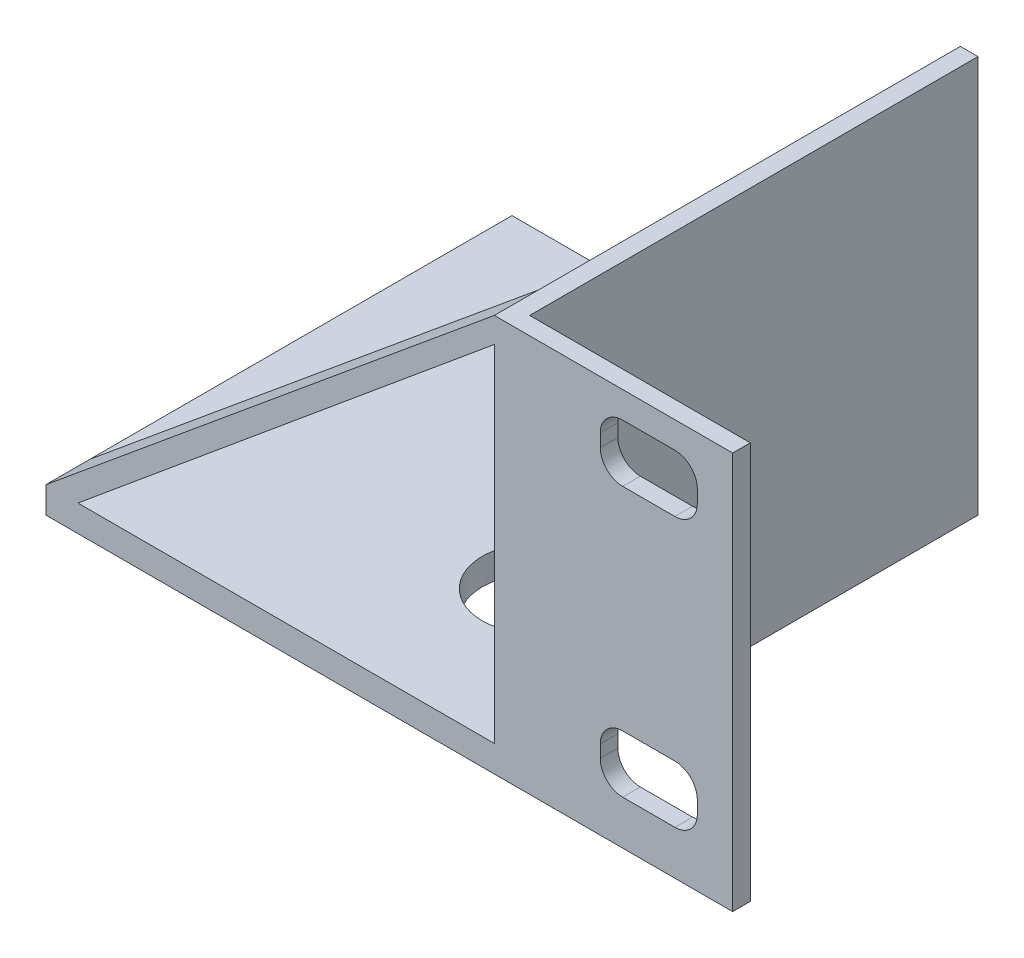
ISO-10303-21;
HEADER;
FILE_DESCRIPTION(('STEP AP214'),'2;1');
FILE_NAME('part.step','',(''),(''),'','','');
FILE_SCHEMA(('AUTOMOTIVE_DESIGN { 1 0 10303 214 1 1 1 1 }'));
ENDSEC;
DATA;
#1=APPLICATION_CONTEXT('core data for automotive mechanical design processes');
#2=APPLICATION_PROTOCOL_DEFINITION('international standard','automotive_design',2000,#1);
#3=PRODUCT_CONTEXT('',#1,'mechanical');
#4=PRODUCT('Part','Part','',(#3));
#5=PRODUCT_RELATED_PRODUCT_CATEGORY('part','',(#4));
#6=PRODUCT_DEFINITION_FORMATION('','',#4);
#7=PRODUCT_DEFINITION_CONTEXT('part definition',#1,'design');
#8=PRODUCT_DEFINITION('design','',#6,#7);
#9=PRODUCT_DEFINITION_SHAPE('','',#8);
#10=(LENGTH_UNIT() NAMED_UNIT(*) SI_UNIT(.MILLI.,.METRE.));
#11=(NAMED_UNIT(*) PLANE_ANGLE_UNIT() SI_UNIT($,.RADIAN.));
#12=(NAMED_UNIT(*) SI_UNIT($,.STERADIAN.) SOLID_ANGLE_UNIT());
#13=UNCERTAINTY_MEASURE_WITH_UNIT(LENGTH_MEASURE(1.E-05),#10,'distance_accuracy_value','');
#14=(GEOMETRIC_REPRESENTATION_CONTEXT(3) GLOBAL_UNCERTAINTY_ASSIGNED_CONTEXT((#13)) GLOBAL_UNIT_ASSIGNED_CONTEXT((#10,
#11,#12)) REPRESENTATION_CONTEXT('',''));
#15=CARTESIAN_POINT('',(0.,0.,0.));
#16=DIRECTION('',(0.,0.,1.));
#17=DIRECTION('',(1.,0.,0.));
#18=AXIS2_PLACEMENT_3D('',#15,#16,#17);
#19=CARTESIAN_POINT('',(0.,0.,2.));
#20=DIRECTION('',(-1.,0.,0.));
#21=DIRECTION('',(0.,-1.,0.));
#22=AXIS2_PLACEMENT_3D('',#19,#20,#21);
#23=PLANE('',#22);
#24=DIRECTION('',(0.,1.,0.));
#25=VECTOR('',#24,1.);
#26=CARTESIAN_POINT('',(0.,0.,0.));
#27=LINE('',#26,#25);
#28=CARTESIAN_POINT('',(0.,0.,0.));
#29=VERTEX_POINT('',#28);
#30=CARTESIAN_POINT('',(0.,45.0000000000001,0.));
#31=VERTEX_POINT('',#30);
#32=EDGE_CURVE('E302',#29,#31,#27,.T.);
#33=ORIENTED_EDGE('',*,*,#32,.T.);
#34=DIRECTION('',(0.,0.,-1.));
#35=VECTOR('',#34,1.);
#36=CARTESIAN_POINT('',(0.,45.0000000000001,2.));
#37=LINE('',#36,#35);
#38=CARTESIAN_POINT('',(0.,45.0000000000001,2.));
#39=VERTEX_POINT('',#38);
#40=EDGE_CURVE('E327',#39,#31,#37,.T.);
#41=ORIENTED_EDGE('',*,*,#40,.F.);
#42=DIRECTION('',(0.,1.,0.));
#43=VECTOR('',#42,1.);
#44=CARTESIAN_POINT('',(0.,0.,2.));
#45=LINE('',#44,#43);
#46=CARTESIAN_POINT('',(0.,0.,2.));
#47=VERTEX_POINT('',#46);
#48=EDGE_CURVE('E230',#47,#39,#45,.T.);
#49=ORIENTED_EDGE('',*,*,#48,.F.);
#50=DIRECTION('',(0.,0.,-1.));
#51=VECTOR('',#50,1.);
#52=CARTESIAN_POINT('',(0.,0.,2.));
#53=LINE('',#52,#51);
#54=EDGE_CURVE('E316',#47,#29,#53,.T.);
#55=ORIENTED_EDGE('',*,*,#54,.T.);
#56=EDGE_LOOP('',(#33,#41,#49,#55));
#57=FACE_BOUND('',#56,.T.);
#58=ADVANCED_FACE('F33',(#57),#23,.F.);
#59=CARTESIAN_POINT('',(0.,45.0000000000001,2.));
#60=DIRECTION('',(0.,-1.,0.));
#61=DIRECTION('',(1.,0.,0.));
#62=AXIS2_PLACEMENT_3D('',#59,#60,#61);
#63=PLANE('',#62);
#64=DIRECTION('',(-1.,0.,0.));
#65=VECTOR('',#64,1.);
#66=CARTESIAN_POINT('',(0.,45.0000000000001,0.));
#67=LINE('',#66,#65);
#68=CARTESIAN_POINT('',(-25.,45.,0.));
#69=VERTEX_POINT('',#68);
#70=EDGE_CURVE('E319',#31,#69,#67,.T.);
#71=ORIENTED_EDGE('',*,*,#70,.T.);
#72=DIRECTION('',(0.,0.,-1.));
#73=VECTOR('',#72,1.);
#74=CARTESIAN_POINT('',(-25.,45.,0.));
#75=LINE('',#74,#73);
#76=CARTESIAN_POINT('',(-25.,45.,-50.8));
#77=VERTEX_POINT('',#76);
#78=EDGE_CURVE('E271',#69,#77,#75,.T.);
#79=ORIENTED_EDGE('',*,*,#78,.T.);
#80=DIRECTION('',(1.,0.,0.));
#81=VECTOR('',#80,1.);
#82=CARTESIAN_POINT('',(-27.,45.,-50.8));
#83=LINE('',#82,#81);
#84=CARTESIAN_POINT('',(-27.,45.,-50.8));
#85=VERTEX_POINT('',#84);
#86=EDGE_CURVE('E285',#85,#77,#83,.T.);
#87=ORIENTED_EDGE('',*,*,#86,.F.);
#88=DIRECTION('',(0.,0.,-1.));
#89=VECTOR('',#88,1.);
#90=CARTESIAN_POINT('',(-27.,45.,2.));
#91=LINE('',#90,#89);
#92=CARTESIAN_POINT('',(-27.,45.,-3.));
#93=VERTEX_POINT('',#92);
#94=EDGE_CURVE('E216',#93,#85,#91,.T.);
#95=ORIENTED_EDGE('',*,*,#94,.F.);
#96=CARTESIAN_POINT('',(-27.,45.,2.));
#97=VERTEX_POINT('',#96);
#98=EDGE_CURVE('E209',#97,#93,#91,.T.);
#99=ORIENTED_EDGE('',*,*,#98,.F.);
#100=DIRECTION('',(-1.,0.,0.));
#101=VECTOR('',#100,1.);
#102=CARTESIAN_POINT('',(0.,45.0000000000001,2.));
#103=LINE('',#102,#101);
#104=EDGE_CURVE('E213',#39,#97,#103,.T.);
#105=ORIENTED_EDGE('',*,*,#104,.F.);
#106=ORIENTED_EDGE('',*,*,#40,.T.);
#107=EDGE_LOOP('',(#71,#79,#87,#95,#99,#105,#106));
#108=FACE_BOUND('',#107,.T.);
#109=ADVANCED_FACE('F211',(#108),#63,.F.);
#110=CARTESIAN_POINT('',(0.,0.,2.));
#111=DIRECTION('',(0.,1.,0.));
#112=DIRECTION('',(-1.,0.,0.));
#113=AXIS2_PLACEMENT_3D('',#110,#111,#112);
#114=PLANE('',#113);
#115=CARTESIAN_POINT('',(-39.7,-1.23599047663348E-13,-15.7));
#116=DIRECTION('',(0.,1.,0.));
#117=DIRECTION('',(-1.,0.,0.));
#118=AXIS2_PLACEMENT_3D('',#115,#116,#117);
#119=CIRCLE('',#118,6.35);
#120=CARTESIAN_POINT('',(-46.05,-1.43351375886795E-13,-15.7));
#121=VERTEX_POINT('',#120);
#122=EDGE_CURVE('E242',#121,#121,#119,.T.);
#123=ORIENTED_EDGE('',*,*,#122,.T.);
#124=EDGE_LOOP('',(#123));
#125=FACE_BOUND('',#124,.T.);
#126=DIRECTION('',(1.,0.,0.));
#127=VECTOR('',#126,1.);
#128=CARTESIAN_POINT('',(0.,0.,0.));
#129=LINE('',#128,#127);
#130=CARTESIAN_POINT('',(-25.,0.,0.));
#131=VERTEX_POINT('',#130);
#132=EDGE_CURVE('E313',#131,#29,#129,.T.);
#133=ORIENTED_EDGE('',*,*,#132,.T.);
#134=ORIENTED_EDGE('',*,*,#54,.F.);
#135=DIRECTION('',(1.,0.,0.));
#136=VECTOR('',#135,1.);
#137=CARTESIAN_POINT('',(0.,0.,2.));
#138=LINE('',#137,#136);
#139=CARTESIAN_POINT('',(-77.8,0.,2.));
#140=VERTEX_POINT('',#139);
#141=EDGE_CURVE('E232',#140,#47,#138,.T.);
#142=ORIENTED_EDGE('',*,*,#141,.F.);
#143=DIRECTION('',(0.,0.,1.));
#144=VECTOR('',#143,1.);
#145=CARTESIAN_POINT('',(-77.8,0.,-50.8));
#146=LINE('',#145,#144);
#147=CARTESIAN_POINT('',(-77.8,0.,-50.8));
#148=VERTEX_POINT('',#147);
#149=EDGE_CURVE('E258',#148,#140,#146,.T.);
#150=ORIENTED_EDGE('',*,*,#149,.F.);
#151=DIRECTION('',(1.,0.,0.));
#152=VECTOR('',#151,1.);
#153=CARTESIAN_POINT('',(-27.,0.,-50.8));
#154=LINE('',#153,#152);
#155=CARTESIAN_POINT('',(-25.,0.,-50.8));
#156=VERTEX_POINT('',#155);
#157=EDGE_CURVE('E276',#148,#156,#154,.T.);
#158=ORIENTED_EDGE('',*,*,#157,.T.);
#159=DIRECTION('',(0.,0.,1.));
#160=VECTOR('',#159,1.);
#161=CARTESIAN_POINT('',(-25.,0.,2.));
#162=LINE('',#161,#160);
#163=EDGE_CURVE('E273',#156,#131,#162,.T.);
#164=ORIENTED_EDGE('',*,*,#163,.T.);
#165=EDGE_LOOP('',(#133,#134,#142,#150,#158,#164));
#166=FACE_BOUND('',#165,.T.);
#167=ADVANCED_FACE('F472',(#125,#166),#114,.F.);
#168=CARTESIAN_POINT('',(0.,0.,2.));
#169=DIRECTION('',(0.,0.,1.));
#170=DIRECTION('',(1.,0.,0.));
#171=AXIS2_PLACEMENT_3D('',#168,#169,#170);
#172=PLANE('',#171);
#173=DIRECTION('',(1.,0.,0.));
#174=VECTOR('',#173,1.);
#175=CARTESIAN_POINT('',(-77.8,2.99999999999999,2.));
#176=LINE('',#175,#174);
#177=CARTESIAN_POINT('',(-74.1844962135835,2.99999999999999,2.));
#178=VERTEX_POINT('',#177);
#179=CARTESIAN_POINT('',(-27.,2.99999999999999,2.));
#180=VERTEX_POINT('',#179);
#181=EDGE_CURVE('E269',#178,#180,#176,.T.);
#182=ORIENTED_EDGE('',*,*,#181,.F.);
#183=DIRECTION('',(0.76957203762493,0.638560004154514,0.));
#184=VECTOR('',#183,1.);
#185=CARTESIAN_POINT('',(-77.8,0.,2.));
#186=LINE('',#185,#184);
#187=CARTESIAN_POINT('',(-27.,42.1518020732182,2.));
#188=VERTEX_POINT('',#187);
#189=EDGE_CURVE('E238',#178,#188,#186,.T.);
#190=ORIENTED_EDGE('',*,*,#189,.T.);
#191=DIRECTION('',(0.,1.,0.));
#192=VECTOR('',#191,1.);
#193=CARTESIAN_POINT('',(-27.,0.,2.));
#194=LINE('',#193,#192);
#195=EDGE_CURVE('E272',#180,#188,#194,.T.);
#196=ORIENTED_EDGE('',*,*,#195,.F.);
#197=EDGE_LOOP('',(#182,#190,#196));
#198=FACE_BOUND('',#197,.T.);
#199=DIRECTION('',(0.,1.,0.));
#200=VECTOR('',#199,1.);
#201=CARTESIAN_POINT('',(-77.8,0.,2.));
#202=LINE('',#201,#200);
#203=CARTESIAN_POINT('',(-77.8,2.99999999999999,2.));
#204=VERTEX_POINT('',#203);
#205=EDGE_CURVE('E260',#140,#204,#202,.T.);
#206=ORIENTED_EDGE('',*,*,#205,.F.);
#207=ORIENTED_EDGE('',*,*,#141,.T.);
#208=ORIENTED_EDGE('',*,*,#48,.T.);
#209=ORIENTED_EDGE('',*,*,#104,.T.);
#210=DIRECTION('',(-0.770702582293763,-0.637195048353112,0.));
#211=VECTOR('',#210,1.);
#212=CARTESIAN_POINT('',(-77.8,2.99999999999999,2.));
#213=LINE('',#212,#211);
#214=EDGE_CURVE('E227',#97,#204,#213,.T.);
#215=ORIENTED_EDGE('',*,*,#214,.T.);
#216=EDGE_LOOP('',(#206,#207,#208,#209,#215));
#217=FACE_BOUND('',#216,.T.);
#218=DIRECTION('',(-1.,0.,0.));
#219=VECTOR('',#218,1.);
#220=CARTESIAN_POINT('',(-4.,11.5,2.));
#221=LINE('',#220,#219);
#222=CARTESIAN_POINT('',(-6.54,11.5,2.));
#223=VERTEX_POINT('',#222);
#224=CARTESIAN_POINT('',(-12.46,11.5,2.));
#225=VERTEX_POINT('',#224);
#226=EDGE_CURVE('E289',#223,#225,#221,.T.);
#227=ORIENTED_EDGE('',*,*,#226,.F.);
#228=CARTESIAN_POINT('',(-6.54,8.96000000000004,2.));
#229=DIRECTION('',(0.,0.,1.));
#230=DIRECTION('',(1.,0.,0.));
#231=AXIS2_PLACEMENT_3D('',#228,#229,#230);
#232=CIRCLE('',#231,2.54);
#233=CARTESIAN_POINT('',(-4.,8.96000000000004,2.));
#234=VERTEX_POINT('',#233);
#235=EDGE_CURVE('E405',#223,#234,#232,.F.);
#236=ORIENTED_EDGE('',*,*,#235,.T.);
#237=DIRECTION('',(0.,1.,0.));
#238=VECTOR('',#237,1.);
#239=CARTESIAN_POINT('',(-4.,5.00000000000004,2.));
#240=LINE('',#239,#238);
#241=CARTESIAN_POINT('',(-4.,7.54000000000004,2.));
#242=VERTEX_POINT('',#241);
#243=EDGE_CURVE('E299',#242,#234,#240,.T.);
#244=ORIENTED_EDGE('',*,*,#243,.F.);
#245=CARTESIAN_POINT('',(-6.54,7.54000000000004,2.));
#246=DIRECTION('',(0.,0.,1.));
#247=DIRECTION('',(1.,0.,0.));
#248=AXIS2_PLACEMENT_3D('',#245,#246,#247);
#249=CIRCLE('',#248,2.54);
#250=CARTESIAN_POINT('',(-6.54000000000001,5.00000000000004,2.));
#251=VERTEX_POINT('',#250);
#252=EDGE_CURVE('E401',#242,#251,#249,.F.);
#253=ORIENTED_EDGE('',*,*,#252,.T.);
#254=DIRECTION('',(1.,0.,0.));
#255=VECTOR('',#254,1.);
#256=CARTESIAN_POINT('',(-15.,5.00000000000004,2.));
#257=LINE('',#256,#255);
#258=CARTESIAN_POINT('',(-12.46,5.00000000000004,2.));
#259=VERTEX_POINT('',#258);
#260=EDGE_CURVE('E296',#259,#251,#257,.T.);
#261=ORIENTED_EDGE('',*,*,#260,.F.);
#262=CARTESIAN_POINT('',(-12.46,7.54000000000004,2.));
#263=DIRECTION('',(0.,0.,1.));
#264=DIRECTION('',(1.,0.,0.));
#265=AXIS2_PLACEMENT_3D('',#262,#263,#264);
#266=CIRCLE('',#265,2.54);
#267=CARTESIAN_POINT('',(-15.,7.54000000000004,2.));
#268=VERTEX_POINT('',#267);
#269=EDGE_CURVE('E393',#259,#268,#266,.F.);
#270=ORIENTED_EDGE('',*,*,#269,.T.);
#271=DIRECTION('',(0.,-1.,0.));
#272=VECTOR('',#271,1.);
#273=CARTESIAN_POINT('',(-15.,11.5,2.));
#274=LINE('',#273,#272);
#275=CARTESIAN_POINT('',(-15.,8.96000000000004,2.));
#276=VERTEX_POINT('',#275);
#277=EDGE_CURVE('E292',#276,#268,#274,.T.);
#278=ORIENTED_EDGE('',*,*,#277,.F.);
#279=CARTESIAN_POINT('',(-12.46,8.96000000000004,2.));
#280=DIRECTION('',(0.,0.,1.));
#281=DIRECTION('',(1.,0.,0.));
#282=AXIS2_PLACEMENT_3D('',#279,#280,#281);
#283=CIRCLE('',#282,2.54);
#284=EDGE_CURVE('E397',#276,#225,#283,.F.);
#285=ORIENTED_EDGE('',*,*,#284,.T.);
#286=EDGE_LOOP('',(#227,#236,#244,#253,#261,#270,#278,#285));
#287=FACE_BOUND('',#286,.T.);
#288=DIRECTION('',(-1.,0.,0.));
#289=VECTOR('',#288,1.);
#290=CARTESIAN_POINT('',(-4.00000000000002,42.0000000000001,2.));
#291=LINE('',#290,#289);
#292=CARTESIAN_POINT('',(-6.54000000000004,42.0000000000001,2.));
#293=VERTEX_POINT('',#292);
#294=CARTESIAN_POINT('',(-12.46,42.,2.));
#295=VERTEX_POINT('',#294);
#296=EDGE_CURVE('E288',#293,#295,#291,.T.);
#297=ORIENTED_EDGE('',*,*,#296,.F.);
#298=CARTESIAN_POINT('',(-6.54000000000002,39.4600000000001,2.));
#299=DIRECTION('',(0.,0.,1.));
#300=DIRECTION('',(1.,0.,0.));
#301=AXIS2_PLACEMENT_3D('',#298,#299,#300);
#302=CIRCLE('',#301,2.54);
#303=CARTESIAN_POINT('',(-4.00000000000002,39.4600000000001,2.));
#304=VERTEX_POINT('',#303);
#305=EDGE_CURVE('E413',#293,#304,#302,.F.);
#306=ORIENTED_EDGE('',*,*,#305,.T.);
#307=DIRECTION('',(0.,1.,0.));
#308=VECTOR('',#307,1.);
#309=CARTESIAN_POINT('',(-4.00000000000002,35.5,2.));
#310=LINE('',#309,#308);
#311=CARTESIAN_POINT('',(-4.00000000000002,38.04,2.));
#312=VERTEX_POINT('',#311);
#313=EDGE_CURVE('E293',#312,#304,#310,.T.);
#314=ORIENTED_EDGE('',*,*,#313,.F.);
#315=CARTESIAN_POINT('',(-6.54000000000002,38.04,2.));
#316=DIRECTION('',(0.,0.,1.));
#317=DIRECTION('',(1.,0.,0.));
#318=AXIS2_PLACEMENT_3D('',#315,#316,#317);
#319=CIRCLE('',#318,2.54);
#320=CARTESIAN_POINT('',(-6.54000000000002,35.5,2.));
#321=VERTEX_POINT('',#320);
#322=EDGE_CURVE('E409',#312,#321,#319,.F.);
#323=ORIENTED_EDGE('',*,*,#322,.T.);
#324=DIRECTION('',(1.,0.,0.));
#325=VECTOR('',#324,1.);
#326=CARTESIAN_POINT('',(-15.,35.5,2.));
#327=LINE('',#326,#325);
#328=CARTESIAN_POINT('',(-12.46,35.5,2.));
#329=VERTEX_POINT('',#328);
#330=EDGE_CURVE('E308',#329,#321,#327,.T.);
#331=ORIENTED_EDGE('',*,*,#330,.F.);
#332=CARTESIAN_POINT('',(-12.46,38.04,2.));
#333=DIRECTION('',(0.,0.,1.));
#334=DIRECTION('',(1.,0.,0.));
#335=AXIS2_PLACEMENT_3D('',#332,#333,#334);
#336=CIRCLE('',#335,2.54);
#337=CARTESIAN_POINT('',(-15.,38.04,2.));
#338=VERTEX_POINT('',#337);
#339=EDGE_CURVE('E41',#329,#338,#336,.F.);
#340=ORIENTED_EDGE('',*,*,#339,.T.);
#341=DIRECTION('',(0.,-1.,0.));
#342=VECTOR('',#341,1.);
#343=CARTESIAN_POINT('',(-15.,42.,2.));
#344=LINE('',#343,#342);
#345=CARTESIAN_POINT('',(-15.,39.4600000000001,2.));
#346=VERTEX_POINT('',#345);
#347=EDGE_CURVE('E305',#346,#338,#344,.T.);
#348=ORIENTED_EDGE('',*,*,#347,.F.);
#349=CARTESIAN_POINT('',(-12.46,39.4600000000001,2.));
#350=DIRECTION('',(0.,0.,1.));
#351=DIRECTION('',(1.,0.,0.));
#352=AXIS2_PLACEMENT_3D('',#349,#350,#351);
#353=CIRCLE('',#352,2.54);
#354=EDGE_CURVE('E417',#346,#295,#353,.F.);
#355=ORIENTED_EDGE('',*,*,#354,.T.);
#356=EDGE_LOOP('',(#297,#306,#314,#323,#331,#340,#348,#355));
#357=FACE_BOUND('',#356,.T.);
#358=ADVANCED_FACE('F225',(#198,#217,#287,#357),#172,.T.);
#359=CARTESIAN_POINT('',(0.,0.,0.));
#360=DIRECTION('',(0.,0.,1.));
#361=DIRECTION('',(1.,0.,0.));
#362=AXIS2_PLACEMENT_3D('',#359,#360,#361);
#363=PLANE('',#362);
#364=DIRECTION('',(1.,0.,0.));
#365=VECTOR('',#364,1.);
#366=CARTESIAN_POINT('',(0.,5.00000000000004,0.));
#367=LINE('',#366,#365);
#368=CARTESIAN_POINT('',(-12.46,5.00000000000004,0.));
#369=VERTEX_POINT('',#368);
#370=CARTESIAN_POINT('',(-6.54,5.00000000000004,0.));
#371=VERTEX_POINT('',#370);
#372=EDGE_CURVE('E344',#369,#371,#367,.T.);
#373=ORIENTED_EDGE('',*,*,#372,.T.);
#374=CARTESIAN_POINT('',(-6.54,7.54000000000004,0.));
#375=DIRECTION('',(0.,0.,1.));
#376=DIRECTION('',(1.,0.,0.));
#377=AXIS2_PLACEMENT_3D('',#374,#375,#376);
#378=CIRCLE('',#377,2.54);
#379=CARTESIAN_POINT('',(-4.,7.54000000000004,0.));
#380=VERTEX_POINT('',#379);
#381=EDGE_CURVE('E403',#371,#380,#378,.T.);
#382=ORIENTED_EDGE('',*,*,#381,.T.);
#383=DIRECTION('',(0.,1.,0.));
#384=VECTOR('',#383,1.);
#385=CARTESIAN_POINT('',(-4.,0.,0.));
#386=LINE('',#385,#384);
#387=CARTESIAN_POINT('',(-4.,8.96000000000004,0.));
#388=VERTEX_POINT('',#387);
#389=EDGE_CURVE('E347',#380,#388,#386,.T.);
#390=ORIENTED_EDGE('',*,*,#389,.T.);
#391=CARTESIAN_POINT('',(-6.54,8.96000000000004,0.));
#392=DIRECTION('',(0.,0.,1.));
#393=DIRECTION('',(1.,0.,0.));
#394=AXIS2_PLACEMENT_3D('',#391,#392,#393);
#395=CIRCLE('',#394,2.54);
#396=CARTESIAN_POINT('',(-6.54,11.5,0.));
#397=VERTEX_POINT('',#396);
#398=EDGE_CURVE('E407',#388,#397,#395,.T.);
#399=ORIENTED_EDGE('',*,*,#398,.T.);
#400=DIRECTION('',(-1.,0.,0.));
#401=VECTOR('',#400,1.);
#402=CARTESIAN_POINT('',(0.,11.5,0.));
#403=LINE('',#402,#401);
#404=CARTESIAN_POINT('',(-12.46,11.5,0.));
#405=VERTEX_POINT('',#404);
#406=EDGE_CURVE('E350',#397,#405,#403,.T.);
#407=ORIENTED_EDGE('',*,*,#406,.T.);
#408=CARTESIAN_POINT('',(-12.46,8.96000000000004,0.));
#409=DIRECTION('',(0.,0.,1.));
#410=DIRECTION('',(1.,0.,0.));
#411=AXIS2_PLACEMENT_3D('',#408,#409,#410);
#412=CIRCLE('',#411,2.54);
#413=CARTESIAN_POINT('',(-15.,8.96000000000004,0.));
#414=VERTEX_POINT('',#413);
#415=EDGE_CURVE('E399',#405,#414,#412,.T.);
#416=ORIENTED_EDGE('',*,*,#415,.T.);
#417=DIRECTION('',(0.,-1.,0.));
#418=VECTOR('',#417,1.);
#419=CARTESIAN_POINT('',(-15.,0.,0.));
#420=LINE('',#419,#418);
#421=CARTESIAN_POINT('',(-15.,7.54000000000004,0.));
#422=VERTEX_POINT('',#421);
#423=EDGE_CURVE('E341',#414,#422,#420,.T.);
#424=ORIENTED_EDGE('',*,*,#423,.T.);
#425=CARTESIAN_POINT('',(-12.46,7.54000000000004,0.));
#426=DIRECTION('',(0.,0.,1.));
#427=DIRECTION('',(1.,0.,0.));
#428=AXIS2_PLACEMENT_3D('',#425,#426,#427);
#429=CIRCLE('',#428,2.54);
#430=EDGE_CURVE('E395',#422,#369,#429,.T.);
#431=ORIENTED_EDGE('',*,*,#430,.T.);
#432=EDGE_LOOP('',(#373,#382,#390,#399,#407,#416,#424,#431));
#433=FACE_BOUND('',#432,.T.);
#434=DIRECTION('',(1.,0.,0.));
#435=VECTOR('',#434,1.);
#436=CARTESIAN_POINT('',(0.,35.5,0.));
#437=LINE('',#436,#435);
#438=CARTESIAN_POINT('',(-12.46,35.5,0.));
#439=VERTEX_POINT('',#438);
#440=CARTESIAN_POINT('',(-6.54000000000002,35.5,0.));
#441=VERTEX_POINT('',#440);
#442=EDGE_CURVE('E332',#439,#441,#437,.T.);
#443=ORIENTED_EDGE('',*,*,#442,.T.);
#444=CARTESIAN_POINT('',(-6.54000000000002,38.04,0.));
#445=DIRECTION('',(0.,0.,1.));
#446=DIRECTION('',(1.,0.,0.));
#447=AXIS2_PLACEMENT_3D('',#444,#445,#446);
#448=CIRCLE('',#447,2.54);
#449=CARTESIAN_POINT('',(-4.00000000000002,38.04,0.));
#450=VERTEX_POINT('',#449);
#451=EDGE_CURVE('E411',#441,#450,#448,.T.);
#452=ORIENTED_EDGE('',*,*,#451,.T.);
#453=DIRECTION('',(0.,1.,0.));
#454=VECTOR('',#453,1.);
#455=CARTESIAN_POINT('',(-4.00000000000002,0.,0.));
#456=LINE('',#455,#454);
#457=CARTESIAN_POINT('',(-4.00000000000002,39.4600000000001,0.));
#458=VERTEX_POINT('',#457);
#459=EDGE_CURVE('E335',#450,#458,#456,.T.);
#460=ORIENTED_EDGE('',*,*,#459,.T.);
#461=CARTESIAN_POINT('',(-6.54000000000002,39.4600000000001,0.));
#462=DIRECTION('',(0.,0.,1.));
#463=DIRECTION('',(1.,0.,0.));
#464=AXIS2_PLACEMENT_3D('',#461,#462,#463);
#465=CIRCLE('',#464,2.54);
#466=CARTESIAN_POINT('',(-6.54000000000004,42.0000000000001,0.));
#467=VERTEX_POINT('',#466);
#468=EDGE_CURVE('E415',#458,#467,#465,.T.);
#469=ORIENTED_EDGE('',*,*,#468,.T.);
#470=DIRECTION('',(-1.,0.,0.));
#471=VECTOR('',#470,1.);
#472=CARTESIAN_POINT('',(-2.1195166833753E-13,42.0000000000001,0.));
#473=LINE('',#472,#471);
#474=CARTESIAN_POINT('',(-12.46,42.,0.));
#475=VERTEX_POINT('',#474);
#476=EDGE_CURVE('E338',#467,#475,#473,.T.);
#477=ORIENTED_EDGE('',*,*,#476,.T.);
#478=CARTESIAN_POINT('',(-12.46,39.4600000000001,0.));
#479=DIRECTION('',(0.,0.,1.));
#480=DIRECTION('',(1.,0.,0.));
#481=AXIS2_PLACEMENT_3D('',#478,#479,#480);
#482=CIRCLE('',#481,2.54);
#483=CARTESIAN_POINT('',(-15.,39.4600000000001,0.));
#484=VERTEX_POINT('',#483);
#485=EDGE_CURVE('E419',#475,#484,#482,.T.);
#486=ORIENTED_EDGE('',*,*,#485,.T.);
#487=DIRECTION('',(0.,-1.,0.));
#488=VECTOR('',#487,1.);
#489=CARTESIAN_POINT('',(-15.,0.,0.));
#490=LINE('',#489,#488);
#491=CARTESIAN_POINT('',(-15.,38.04,0.));
#492=VERTEX_POINT('',#491);
#493=EDGE_CURVE('E329',#484,#492,#490,.T.);
#494=ORIENTED_EDGE('',*,*,#493,.T.);
#495=CARTESIAN_POINT('',(-12.46,38.04,0.));
#496=DIRECTION('',(0.,0.,1.));
#497=DIRECTION('',(1.,0.,0.));
#498=AXIS2_PLACEMENT_3D('',#495,#496,#497);
#499=CIRCLE('',#498,2.54);
#500=EDGE_CURVE('E11',#492,#439,#499,.T.);
#501=ORIENTED_EDGE('',*,*,#500,.T.);
#502=EDGE_LOOP('',(#443,#452,#460,#469,#477,#486,#494,#501));
#503=FACE_BOUND('',#502,.T.);
#504=ORIENTED_EDGE('',*,*,#32,.F.);
#505=ORIENTED_EDGE('',*,*,#132,.F.);
#506=DIRECTION('',(0.,-1.,0.));
#507=VECTOR('',#506,1.);
#508=CARTESIAN_POINT('',(-25.,0.,0.));
#509=LINE('',#508,#507);
#510=EDGE_CURVE('E321',#69,#131,#509,.T.);
#511=ORIENTED_EDGE('',*,*,#510,.F.);
#512=ORIENTED_EDGE('',*,*,#70,.F.);
#513=EDGE_LOOP('',(#504,#505,#511,#512));
#514=FACE_BOUND('',#513,.T.);
#515=ADVANCED_FACE('F434',(#433,#503,#514),#363,.F.);
#516=CARTESIAN_POINT('',(-4.00000000000002,42.0000000000001,-17.78));
#517=DIRECTION('',(0.,1.,0.));
#518=DIRECTION('',(-1.,0.,0.));
#519=AXIS2_PLACEMENT_3D('',#516,#517,#518);
#520=PLANE('',#519);
#521=ORIENTED_EDGE('',*,*,#476,.F.);
#522=DIRECTION('',(0.,0.,1.));
#523=VECTOR('',#522,1.);
#524=CARTESIAN_POINT('',(-6.54000000000004,42.0000000000001,2.));
#525=LINE('',#524,#523);
#526=EDGE_CURVE('E385',#467,#293,#525,.T.);
#527=ORIENTED_EDGE('',*,*,#526,.T.);
#528=ORIENTED_EDGE('',*,*,#296,.T.);
#529=DIRECTION('',(0.,0.,1.));
#530=VECTOR('',#529,1.);
#531=CARTESIAN_POINT('',(-12.46,42.,0.));
#532=LINE('',#531,#530);
#533=EDGE_CURVE('E383',#295,#475,#532,.F.);
#534=ORIENTED_EDGE('',*,*,#533,.T.);
#535=EDGE_LOOP('',(#521,#527,#528,#534));
#536=FACE_BOUND('',#535,.T.);
#537=ADVANCED_FACE('F455',(#536),#520,.F.);
#538=CARTESIAN_POINT('',(-4.00000000000002,35.5,-17.78));
#539=DIRECTION('',(1.,0.,0.));
#540=DIRECTION('',(0.,0.,-1.));
#541=AXIS2_PLACEMENT_3D('',#538,#539,#540);
#542=PLANE('',#541);
#543=ORIENTED_EDGE('',*,*,#459,.F.);
#544=DIRECTION('',(0.,0.,1.));
#545=VECTOR('',#544,1.);
#546=CARTESIAN_POINT('',(-4.00000000000002,38.04,2.));
#547=LINE('',#546,#545);
#548=EDGE_CURVE('E375',#450,#312,#547,.T.);
#549=ORIENTED_EDGE('',*,*,#548,.T.);
#550=ORIENTED_EDGE('',*,*,#313,.T.);
#551=DIRECTION('',(0.,0.,1.));
#552=VECTOR('',#551,1.);
#553=CARTESIAN_POINT('',(-4.00000000000002,39.4600000000001,0.));
#554=LINE('',#553,#552);
#555=EDGE_CURVE('E373',#304,#458,#554,.F.);
#556=ORIENTED_EDGE('',*,*,#555,.T.);
#557=EDGE_LOOP('',(#543,#549,#550,#556));
#558=FACE_BOUND('',#557,.T.);
#559=ADVANCED_FACE('F446',(#558),#542,.F.);
#560=CARTESIAN_POINT('',(-15.,35.5,-17.78));
#561=DIRECTION('',(0.,-1.,0.));
#562=DIRECTION('',(0.,0.,-1.));
#563=AXIS2_PLACEMENT_3D('',#560,#561,#562);
#564=PLANE('',#563);
#565=ORIENTED_EDGE('',*,*,#330,.T.);
#566=DIRECTION('',(0.,0.,1.));
#567=VECTOR('',#566,1.);
#568=CARTESIAN_POINT('',(-6.54000000000002,35.5,0.));
#569=LINE('',#568,#567);
#570=EDGE_CURVE('E381',#321,#441,#569,.F.);
#571=ORIENTED_EDGE('',*,*,#570,.T.);
#572=ORIENTED_EDGE('',*,*,#442,.F.);
#573=DIRECTION('',(0.,0.,1.));
#574=VECTOR('',#573,1.);
#575=CARTESIAN_POINT('',(-12.46,35.5,2.));
#576=LINE('',#575,#574);
#577=EDGE_CURVE('E378',#439,#329,#576,.T.);
#578=ORIENTED_EDGE('',*,*,#577,.T.);
#579=EDGE_LOOP('',(#565,#571,#572,#578));
#580=FACE_BOUND('',#579,.T.);
#581=ADVANCED_FACE('F438',(#580),#564,.F.);
#582=CARTESIAN_POINT('',(-15.,42.,-17.78));
#583=DIRECTION('',(-1.,0.,0.));
#584=DIRECTION('',(0.,0.,1.));
#585=AXIS2_PLACEMENT_3D('',#582,#583,#584);
#586=PLANE('',#585);
#587=ORIENTED_EDGE('',*,*,#493,.F.);
#588=DIRECTION('',(0.,0.,1.));
#589=VECTOR('',#588,1.);
#590=CARTESIAN_POINT('',(-15.,39.4600000000001,2.));
#591=LINE('',#590,#589);
#592=EDGE_CURVE('E390',#484,#346,#591,.T.);
#593=ORIENTED_EDGE('',*,*,#592,.T.);
#594=ORIENTED_EDGE('',*,*,#347,.T.);
#595=DIRECTION('',(0.,0.,1.));
#596=VECTOR('',#595,1.);
#597=CARTESIAN_POINT('',(-15.,38.04,0.));
#598=LINE('',#597,#596);
#599=EDGE_CURVE('E388',#338,#492,#598,.F.);
#600=ORIENTED_EDGE('',*,*,#599,.T.);
#601=EDGE_LOOP('',(#587,#593,#594,#600));
#602=FACE_BOUND('',#601,.T.);
#603=ADVANCED_FACE('F429',(#602),#586,.F.);
#604=CARTESIAN_POINT('',(-4.,11.5,-17.78));
#605=DIRECTION('',(0.,1.,0.));
#606=DIRECTION('',(0.,0.,1.));
#607=AXIS2_PLACEMENT_3D('',#604,#605,#606);
#608=PLANE('',#607);
#609=ORIENTED_EDGE('',*,*,#226,.T.);
#610=DIRECTION('',(0.,0.,1.));
#611=VECTOR('',#610,1.);
#612=CARTESIAN_POINT('',(-12.46,11.5,0.));
#613=LINE('',#612,#611);
#614=EDGE_CURVE('E366',#225,#405,#613,.F.);
#615=ORIENTED_EDGE('',*,*,#614,.T.);
#616=ORIENTED_EDGE('',*,*,#406,.F.);
#617=DIRECTION('',(0.,0.,1.));
#618=VECTOR('',#617,1.);
#619=CARTESIAN_POINT('',(-6.54,11.5,2.));
#620=LINE('',#619,#618);
#621=EDGE_CURVE('E363',#397,#223,#620,.T.);
#622=ORIENTED_EDGE('',*,*,#621,.T.);
#623=EDGE_LOOP('',(#609,#615,#616,#622));
#624=FACE_BOUND('',#623,.T.);
#625=ADVANCED_FACE('F650',(#624),#608,.F.);
#626=CARTESIAN_POINT('',(-4.,5.00000000000004,-17.78));
#627=DIRECTION('',(1.,0.,0.));
#628=DIRECTION('',(0.,0.,-1.));
#629=AXIS2_PLACEMENT_3D('',#626,#627,#628);
#630=PLANE('',#629);
#631=ORIENTED_EDGE('',*,*,#389,.F.);
#632=DIRECTION('',(0.,0.,1.));
#633=VECTOR('',#632,1.);
#634=CARTESIAN_POINT('',(-4.,7.54000000000004,2.));
#635=LINE('',#634,#633);
#636=EDGE_CURVE('E370',#380,#242,#635,.T.);
#637=ORIENTED_EDGE('',*,*,#636,.T.);
#638=ORIENTED_EDGE('',*,*,#243,.T.);
#639=DIRECTION('',(0.,0.,1.));
#640=VECTOR('',#639,1.);
#641=CARTESIAN_POINT('',(-4.,8.96000000000004,0.));
#642=LINE('',#641,#640);
#643=EDGE_CURVE('E368',#234,#388,#642,.F.);
#644=ORIENTED_EDGE('',*,*,#643,.T.);
#645=EDGE_LOOP('',(#631,#637,#638,#644));
#646=FACE_BOUND('',#645,.T.);
#647=ADVANCED_FACE('F646',(#646),#630,.F.);
#648=CARTESIAN_POINT('',(-15.,5.00000000000004,-17.78));
#649=DIRECTION('',(0.,-1.,0.));
#650=DIRECTION('',(0.,0.,-1.));
#651=AXIS2_PLACEMENT_3D('',#648,#649,#650);
#652=PLANE('',#651);
#653=ORIENTED_EDGE('',*,*,#372,.F.);
#654=DIRECTION('',(0.,0.,1.));
#655=VECTOR('',#654,1.);
#656=CARTESIAN_POINT('',(-12.46,5.00000000000004,2.));
#657=LINE('',#656,#655);
#658=EDGE_CURVE('E355',#369,#259,#657,.T.);
#659=ORIENTED_EDGE('',*,*,#658,.T.);
#660=ORIENTED_EDGE('',*,*,#260,.T.);
#661=DIRECTION('',(0.,0.,1.));
#662=VECTOR('',#661,1.);
#663=CARTESIAN_POINT('',(-6.54,5.00000000000004,0.));
#664=LINE('',#663,#662);
#665=EDGE_CURVE('E353',#251,#371,#664,.F.);
#666=ORIENTED_EDGE('',*,*,#665,.T.);
#667=EDGE_LOOP('',(#653,#659,#660,#666));
#668=FACE_BOUND('',#667,.T.);
#669=ADVANCED_FACE('F649',(#668),#652,.F.);
#670=CARTESIAN_POINT('',(-15.,11.5,-17.78));
#671=DIRECTION('',(-1.,0.,0.));
#672=DIRECTION('',(0.,0.,1.));
#673=AXIS2_PLACEMENT_3D('',#670,#671,#672);
#674=PLANE('',#673);
#675=ORIENTED_EDGE('',*,*,#277,.T.);
#676=DIRECTION('',(0.,0.,1.));
#677=VECTOR('',#676,1.);
#678=CARTESIAN_POINT('',(-15.,7.54000000000004,0.));
#679=LINE('',#678,#677);
#680=EDGE_CURVE('E361',#268,#422,#679,.F.);
#681=ORIENTED_EDGE('',*,*,#680,.T.);
#682=ORIENTED_EDGE('',*,*,#423,.F.);
#683=DIRECTION('',(0.,0.,1.));
#684=VECTOR('',#683,1.);
#685=CARTESIAN_POINT('',(-15.,8.96000000000004,2.));
#686=LINE('',#685,#684);
#687=EDGE_CURVE('E358',#414,#276,#686,.T.);
#688=ORIENTED_EDGE('',*,*,#687,.T.);
#689=EDGE_LOOP('',(#675,#681,#682,#688));
#690=FACE_BOUND('',#689,.T.);
#691=ADVANCED_FACE('F480',(#690),#674,.F.);
#692=CARTESIAN_POINT('',(-12.46,7.54000000000004,-17.78));
#693=DIRECTION('',(0.,0.,-1.));
#694=DIRECTION('',(-1.,0.,0.));
#695=AXIS2_PLACEMENT_3D('',#692,#693,#694);
#696=CYLINDRICAL_SURFACE('',#695,2.54);
#697=ORIENTED_EDGE('',*,*,#430,.F.);
#698=ORIENTED_EDGE('',*,*,#680,.F.);
#699=ORIENTED_EDGE('',*,*,#269,.F.);
#700=ORIENTED_EDGE('',*,*,#658,.F.);
#701=EDGE_LOOP('',(#697,#698,#699,#700));
#702=FACE_BOUND('',#701,.T.);
#703=ADVANCED_FACE('F476',(#702),#696,.F.);
#704=CARTESIAN_POINT('',(-12.46,8.96000000000004,-17.78));
#705=DIRECTION('',(0.,0.,-1.));
#706=DIRECTION('',(-1.,0.,0.));
#707=AXIS2_PLACEMENT_3D('',#704,#705,#706);
#708=CYLINDRICAL_SURFACE('',#707,2.54);
#709=ORIENTED_EDGE('',*,*,#415,.F.);
#710=ORIENTED_EDGE('',*,*,#614,.F.);
#711=ORIENTED_EDGE('',*,*,#284,.F.);
#712=ORIENTED_EDGE('',*,*,#687,.F.);
#713=EDGE_LOOP('',(#709,#710,#711,#712));
#714=FACE_BOUND('',#713,.T.);
#715=ADVANCED_FACE('F479',(#714),#708,.F.);
#716=CARTESIAN_POINT('',(-6.54,7.54000000000004,-17.78));
#717=DIRECTION('',(0.,0.,-1.));
#718=DIRECTION('',(-1.,0.,0.));
#719=AXIS2_PLACEMENT_3D('',#716,#717,#718);
#720=CYLINDRICAL_SURFACE('',#719,2.54);
#721=ORIENTED_EDGE('',*,*,#381,.F.);
#722=ORIENTED_EDGE('',*,*,#665,.F.);
#723=ORIENTED_EDGE('',*,*,#252,.F.);
#724=ORIENTED_EDGE('',*,*,#636,.F.);
#725=EDGE_LOOP('',(#721,#722,#723,#724));
#726=FACE_BOUND('',#725,.T.);
#727=ADVANCED_FACE('F484',(#726),#720,.F.);
#728=CARTESIAN_POINT('',(-6.54,8.96000000000004,-17.78));
#729=DIRECTION('',(0.,0.,-1.));
#730=DIRECTION('',(-1.,0.,0.));
#731=AXIS2_PLACEMENT_3D('',#728,#729,#730);
#732=CYLINDRICAL_SURFACE('',#731,2.54);
#733=ORIENTED_EDGE('',*,*,#398,.F.);
#734=ORIENTED_EDGE('',*,*,#643,.F.);
#735=ORIENTED_EDGE('',*,*,#235,.F.);
#736=ORIENTED_EDGE('',*,*,#621,.F.);
#737=EDGE_LOOP('',(#733,#734,#735,#736));
#738=FACE_BOUND('',#737,.T.);
#739=ADVANCED_FACE('F488',(#738),#732,.F.);
#740=CARTESIAN_POINT('',(-6.54000000000002,38.04,-17.78));
#741=DIRECTION('',(0.,0.,-1.));
#742=DIRECTION('',(-1.,0.,0.));
#743=AXIS2_PLACEMENT_3D('',#740,#741,#742);
#744=CYLINDRICAL_SURFACE('',#743,2.54);
#745=ORIENTED_EDGE('',*,*,#451,.F.);
#746=ORIENTED_EDGE('',*,*,#570,.F.);
#747=ORIENTED_EDGE('',*,*,#322,.F.);
#748=ORIENTED_EDGE('',*,*,#548,.F.);
#749=EDGE_LOOP('',(#745,#746,#747,#748));
#750=FACE_BOUND('',#749,.T.);
#751=ADVANCED_FACE('F441',(#750),#744,.F.);
#752=CARTESIAN_POINT('',(-6.54000000000002,39.4600000000001,-17.78));
#753=DIRECTION('',(0.,0.,-1.));
#754=DIRECTION('',(-1.,0.,0.));
#755=AXIS2_PLACEMENT_3D('',#752,#753,#754);
#756=CYLINDRICAL_SURFACE('',#755,2.54);
#757=ORIENTED_EDGE('',*,*,#468,.F.);
#758=ORIENTED_EDGE('',*,*,#555,.F.);
#759=ORIENTED_EDGE('',*,*,#305,.F.);
#760=ORIENTED_EDGE('',*,*,#526,.F.);
#761=EDGE_LOOP('',(#757,#758,#759,#760));
#762=FACE_BOUND('',#761,.T.);
#763=ADVANCED_FACE('F450',(#762),#756,.F.);
#764=CARTESIAN_POINT('',(-12.46,39.4600000000001,-17.78));
#765=DIRECTION('',(0.,0.,-1.));
#766=DIRECTION('',(-1.,0.,0.));
#767=AXIS2_PLACEMENT_3D('',#764,#765,#766);
#768=CYLINDRICAL_SURFACE('',#767,2.54);
#769=ORIENTED_EDGE('',*,*,#485,.F.);
#770=ORIENTED_EDGE('',*,*,#533,.F.);
#771=ORIENTED_EDGE('',*,*,#354,.F.);
#772=ORIENTED_EDGE('',*,*,#592,.F.);
#773=EDGE_LOOP('',(#769,#770,#771,#772));
#774=FACE_BOUND('',#773,.T.);
#775=ADVANCED_FACE('F458',(#774),#768,.F.);
#776=CARTESIAN_POINT('',(-12.46,38.04,-17.78));
#777=DIRECTION('',(0.,0.,-1.));
#778=DIRECTION('',(-1.,0.,0.));
#779=AXIS2_PLACEMENT_3D('',#776,#777,#778);
#780=CYLINDRICAL_SURFACE('',#779,2.54);
#781=ORIENTED_EDGE('',*,*,#500,.F.);
#782=ORIENTED_EDGE('',*,*,#599,.F.);
#783=ORIENTED_EDGE('',*,*,#339,.F.);
#784=ORIENTED_EDGE('',*,*,#577,.F.);
#785=EDGE_LOOP('',(#781,#782,#783,#784));
#786=FACE_BOUND('',#785,.T.);
#787=ADVANCED_FACE('F35',(#786),#780,.F.);
#788=CARTESIAN_POINT('',(-25.,0.,0.));
#789=DIRECTION('',(-1.,0.,0.));
#790=DIRECTION('',(0.,0.,1.));
#791=AXIS2_PLACEMENT_3D('',#788,#789,#790);
#792=PLANE('',#791);
#793=ORIENTED_EDGE('',*,*,#78,.F.);
#794=ORIENTED_EDGE('',*,*,#510,.T.);
#795=ORIENTED_EDGE('',*,*,#163,.F.);
#796=DIRECTION('',(0.,-1.,0.));
#797=VECTOR('',#796,1.);
#798=CARTESIAN_POINT('',(-25.,0.,-50.8));
#799=LINE('',#798,#797);
#800=EDGE_CURVE('E278',#77,#156,#799,.T.);
#801=ORIENTED_EDGE('',*,*,#800,.F.);
#802=EDGE_LOOP('',(#793,#794,#795,#801));
#803=FACE_BOUND('',#802,.T.);
#804=ADVANCED_FACE('F464',(#803),#792,.F.);
#805=CARTESIAN_POINT('',(-27.,0.,-50.8));
#806=DIRECTION('',(0.,0.,1.));
#807=DIRECTION('',(1.,0.,0.));
#808=AXIS2_PLACEMENT_3D('',#805,#806,#807);
#809=PLANE('',#808);
#810=ORIENTED_EDGE('',*,*,#800,.T.);
#811=ORIENTED_EDGE('',*,*,#157,.F.);
#812=DIRECTION('',(0.,-1.,0.));
#813=VECTOR('',#812,1.);
#814=CARTESIAN_POINT('',(-77.8,0.,-50.8));
#815=LINE('',#814,#813);
#816=CARTESIAN_POINT('',(-77.8,2.99999999999999,-50.8));
#817=VERTEX_POINT('',#816);
#818=EDGE_CURVE('E255',#817,#148,#815,.T.);
#819=ORIENTED_EDGE('',*,*,#818,.F.);
#820=DIRECTION('',(1.,0.,0.));
#821=VECTOR('',#820,1.);
#822=CARTESIAN_POINT('',(-77.8,2.99999999999999,-50.8));
#823=LINE('',#822,#821);
#824=CARTESIAN_POINT('',(-27.,2.99999999999999,-50.8));
#825=VERTEX_POINT('',#824);
#826=EDGE_CURVE('E264',#817,#825,#823,.T.);
#827=ORIENTED_EDGE('',*,*,#826,.T.);
#828=DIRECTION('',(0.,-1.,0.));
#829=VECTOR('',#828,1.);
#830=CARTESIAN_POINT('',(-27.,0.,-50.8));
#831=LINE('',#830,#829);
#832=EDGE_CURVE('E220',#85,#825,#831,.T.);
#833=ORIENTED_EDGE('',*,*,#832,.F.);
#834=ORIENTED_EDGE('',*,*,#86,.T.);
#835=EDGE_LOOP('',(#810,#811,#819,#827,#833,#834));
#836=FACE_BOUND('',#835,.T.);
#837=ADVANCED_FACE('F535',(#836),#809,.F.);
#838=CARTESIAN_POINT('',(-27.,0.,0.));
#839=DIRECTION('',(-1.,0.,0.));
#840=DIRECTION('',(0.,0.,1.));
#841=AXIS2_PLACEMENT_3D('',#838,#839,#840);
#842=PLANE('',#841);
#843=DIRECTION('',(0.,0.,1.));
#844=VECTOR('',#843,1.);
#845=CARTESIAN_POINT('',(-27.,42.1518020732182,-3.));
#846=LINE('',#845,#844);
#847=CARTESIAN_POINT('',(-27.,42.1518020732182,-3.));
#848=VERTEX_POINT('',#847);
#849=EDGE_CURVE('E48',#848,#188,#846,.T.);
#850=ORIENTED_EDGE('',*,*,#849,.F.);
#851=DIRECTION('',(0.,1.,0.));
#852=VECTOR('',#851,1.);
#853=CARTESIAN_POINT('',(-27.,45.,-3.));
#854=LINE('',#853,#852);
#855=EDGE_CURVE('E53',#848,#93,#854,.T.);
#856=ORIENTED_EDGE('',*,*,#855,.T.);
#857=ORIENTED_EDGE('',*,*,#94,.T.);
#858=ORIENTED_EDGE('',*,*,#832,.T.);
#859=DIRECTION('',(0.,0.,-1.));
#860=VECTOR('',#859,1.);
#861=CARTESIAN_POINT('',(-27.,2.99999999999999,-50.8));
#862=LINE('',#861,#860);
#863=EDGE_CURVE('E254',#180,#825,#862,.T.);
#864=ORIENTED_EDGE('',*,*,#863,.F.);
#865=ORIENTED_EDGE('',*,*,#195,.T.);
#866=EDGE_LOOP('',(#850,#856,#857,#858,#864,#865));
#867=FACE_BOUND('',#866,.T.);
#868=ADVANCED_FACE('F547',(#867),#842,.T.);
#869=CARTESIAN_POINT('',(-77.8,2.99999999999999,-50.8));
#870=DIRECTION('',(0.,-1.,0.));
#871=DIRECTION('',(0.,0.,-1.));
#872=AXIS2_PLACEMENT_3D('',#869,#870,#871);
#873=PLANE('',#872);
#874=CARTESIAN_POINT('',(-39.7,2.99999999999999,-15.7));
#875=DIRECTION('',(0.,1.,0.));
#876=DIRECTION('',(0.,0.,1.));
#877=AXIS2_PLACEMENT_3D('',#874,#875,#876);
#878=CIRCLE('',#877,6.35);
#879=CARTESIAN_POINT('',(-39.7,2.99999999999999,-9.35));
#880=VERTEX_POINT('',#879);
#881=EDGE_CURVE('E781',#880,#880,#878,.T.);
#882=ORIENTED_EDGE('',*,*,#881,.F.);
#883=EDGE_LOOP('',(#882));
#884=FACE_BOUND('',#883,.T.);
#885=DIRECTION('',(-1.,0.,0.));
#886=VECTOR('',#885,1.);
#887=CARTESIAN_POINT('',(-77.8,2.99999999999999,-3.));
#888=LINE('',#887,#886);
#889=CARTESIAN_POINT('',(-74.1844962135835,2.99999999999999,-3.));
#890=VERTEX_POINT('',#889);
#891=CARTESIAN_POINT('',(-77.8,2.99999999999999,-3.));
#892=VERTEX_POINT('',#891);
#893=EDGE_CURVE('E247',#890,#892,#888,.T.);
#894=ORIENTED_EDGE('',*,*,#893,.F.);
#895=DIRECTION('',(0.,0.,1.));
#896=VECTOR('',#895,1.);
#897=CARTESIAN_POINT('',(-74.1844962135835,2.99999999999999,-50.8));
#898=LINE('',#897,#896);
#899=EDGE_CURVE('E251',#890,#178,#898,.T.);
#900=ORIENTED_EDGE('',*,*,#899,.T.);
#901=ORIENTED_EDGE('',*,*,#181,.T.);
#902=ORIENTED_EDGE('',*,*,#863,.T.);
#903=ORIENTED_EDGE('',*,*,#826,.F.);
#904=DIRECTION('',(0.,0.,-1.));
#905=VECTOR('',#904,1.);
#906=CARTESIAN_POINT('',(-77.8,2.99999999999999,-50.8));
#907=LINE('',#906,#905);
#908=EDGE_CURVE('E262',#892,#817,#907,.T.);
#909=ORIENTED_EDGE('',*,*,#908,.F.);
#910=EDGE_LOOP('',(#894,#900,#901,#902,#903,#909));
#911=FACE_BOUND('',#910,.T.);
#912=ADVANCED_FACE('F577',(#884,#911),#873,.F.);
#913=CARTESIAN_POINT('',(-77.8,0.,0.));
#914=DIRECTION('',(1.,0.,0.));
#915=DIRECTION('',(0.,0.,-1.));
#916=AXIS2_PLACEMENT_3D('',#913,#914,#915);
#917=PLANE('',#916);
#918=EDGE_CURVE('E236',#204,#892,#907,.T.);
#919=ORIENTED_EDGE('',*,*,#918,.T.);
#920=ORIENTED_EDGE('',*,*,#908,.T.);
#921=ORIENTED_EDGE('',*,*,#818,.T.);
#922=ORIENTED_EDGE('',*,*,#149,.T.);
#923=ORIENTED_EDGE('',*,*,#205,.T.);
#924=EDGE_LOOP('',(#919,#920,#921,#922,#923));
#925=FACE_BOUND('',#924,.T.);
#926=ADVANCED_FACE('F584',(#925),#917,.F.);
#927=CARTESIAN_POINT('',(-77.8,0.,-3.));
#928=DIRECTION('',(0.638560004154514,-0.76957203762493,0.));
#929=DIRECTION('',(0.76957203762493,0.638560004154514,0.));
#930=AXIS2_PLACEMENT_3D('',#927,#928,#929);
#931=PLANE('',#930);
#932=ORIENTED_EDGE('',*,*,#899,.F.);
#933=DIRECTION('',(0.76957203762493,0.638560004154514,0.));
#934=VECTOR('',#933,1.);
#935=CARTESIAN_POINT('',(-77.8,0.,-3.));
#936=LINE('',#935,#934);
#937=EDGE_CURVE('E237',#890,#848,#936,.T.);
#938=ORIENTED_EDGE('',*,*,#937,.T.);
#939=ORIENTED_EDGE('',*,*,#849,.T.);
#940=ORIENTED_EDGE('',*,*,#189,.F.);
#941=EDGE_LOOP('',(#932,#938,#939,#940));
#942=FACE_BOUND('',#941,.T.);
#943=ADVANCED_FACE('F588',(#942),#931,.T.);
#944=CARTESIAN_POINT('',(0.,0.,-3.));
#945=DIRECTION('',(0.,0.,1.));
#946=DIRECTION('',(1.,0.,0.));
#947=AXIS2_PLACEMENT_3D('',#944,#945,#946);
#948=PLANE('',#947);
#949=ORIENTED_EDGE('',*,*,#937,.F.);
#950=ORIENTED_EDGE('',*,*,#893,.T.);
#951=DIRECTION('',(-0.770702582293763,-0.637195048353112,0.));
#952=VECTOR('',#951,1.);
#953=CARTESIAN_POINT('',(-77.8,2.99999999999999,-3.));
#954=LINE('',#953,#952);
#955=EDGE_CURVE('E248',#93,#892,#954,.T.);
#956=ORIENTED_EDGE('',*,*,#955,.F.);
#957=ORIENTED_EDGE('',*,*,#855,.F.);
#958=EDGE_LOOP('',(#949,#950,#956,#957));
#959=FACE_BOUND('',#958,.T.);
#960=ADVANCED_FACE('F597',(#959),#948,.F.);
#961=CARTESIAN_POINT('',(-77.8,2.99999999999999,-3.));
#962=DIRECTION('',(-0.637195048353112,0.770702582293764,0.));
#963=DIRECTION('',(-0.770702582293764,-0.637195048353112,0.));
#964=AXIS2_PLACEMENT_3D('',#961,#962,#963);
#965=PLANE('',#964);
#966=ORIENTED_EDGE('',*,*,#214,.F.);
#967=ORIENTED_EDGE('',*,*,#98,.T.);
#968=ORIENTED_EDGE('',*,*,#955,.T.);
#969=ORIENTED_EDGE('',*,*,#918,.F.);
#970=EDGE_LOOP('',(#966,#967,#968,#969));
#971=FACE_BOUND('',#970,.T.);
#972=ADVANCED_FACE('F234',(#971),#965,.T.);
#973=CARTESIAN_POINT('',(-39.7,-2.00000000000001,-15.7));
#974=DIRECTION('',(0.,1.,0.));
#975=DIRECTION('',(0.,0.,1.));
#976=AXIS2_PLACEMENT_3D('',#973,#974,#975);
#977=CYLINDRICAL_SURFACE('',#976,6.35);
#978=ORIENTED_EDGE('',*,*,#881,.T.);
#979=EDGE_LOOP('',(#978));
#980=FACE_BOUND('',#979,.T.);
#981=ORIENTED_EDGE('',*,*,#122,.F.);
#982=EDGE_LOOP('',(#981));
#983=FACE_BOUND('',#982,.T.);
#984=ADVANCED_FACE('F616',(#980,#983),#977,.F.);
#985=CLOSED_SHELL('',(#58,#109,#167,#358,#515,#537,#559,#581,#603,#625,#647,#669,#691,#703,#715,
#727,#739,#751,#763,#775,#787,#804,#837,#868,#912,#926,#943,#960,#972,#984));
#986=MANIFOLD_SOLID_BREP('B2',#985);
#987=ADVANCED_BREP_SHAPE_REPRESENTATION('',(#18,#986),#14);
#988=SHAPE_DEFINITION_REPRESENTATION(#9,#987);
ENDSEC;
END-ISO-10303-21;
